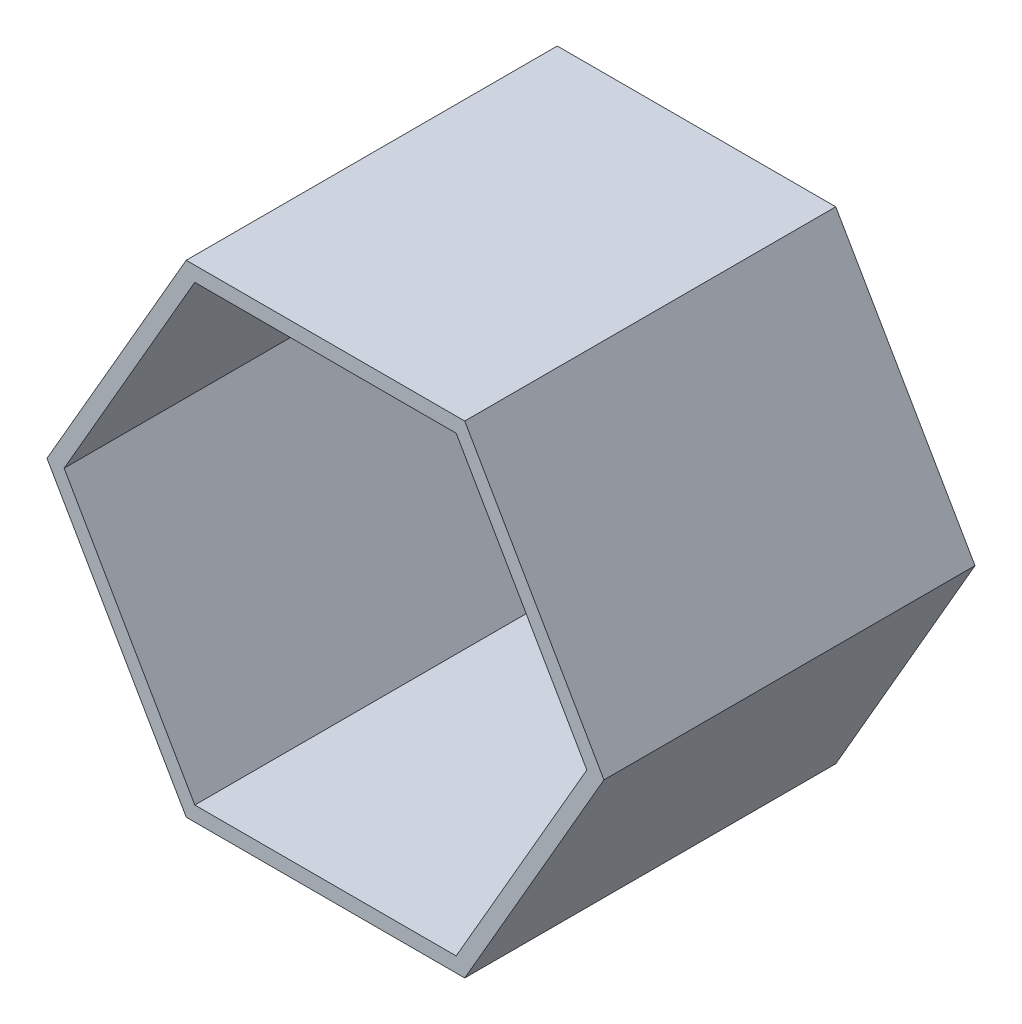
ISO-10303-21;
HEADER;
FILE_DESCRIPTION(('STEP AP214'),'2;1');
FILE_NAME('part.step','',(''),(''),'','','');
FILE_SCHEMA(('AUTOMOTIVE_DESIGN { 1 0 10303 214 1 1 1 1 }'));
ENDSEC;
DATA;
#1=APPLICATION_CONTEXT('core data for automotive mechanical design processes');
#2=APPLICATION_PROTOCOL_DEFINITION('international standard','automotive_design',2000,#1);
#3=PRODUCT_CONTEXT('',#1,'mechanical');
#4=PRODUCT('Part','Part','',(#3));
#5=PRODUCT_RELATED_PRODUCT_CATEGORY('part','',(#4));
#6=PRODUCT_DEFINITION_FORMATION('','',#4);
#7=PRODUCT_DEFINITION_CONTEXT('part definition',#1,'design');
#8=PRODUCT_DEFINITION('design','',#6,#7);
#9=PRODUCT_DEFINITION_SHAPE('','',#8);
#10=(LENGTH_UNIT() NAMED_UNIT(*) SI_UNIT(.MILLI.,.METRE.));
#11=(NAMED_UNIT(*) PLANE_ANGLE_UNIT() SI_UNIT($,.RADIAN.));
#12=(NAMED_UNIT(*) SI_UNIT($,.STERADIAN.) SOLID_ANGLE_UNIT());
#13=UNCERTAINTY_MEASURE_WITH_UNIT(LENGTH_MEASURE(1.E-05),#10,'distance_accuracy_value','');
#14=(GEOMETRIC_REPRESENTATION_CONTEXT(3) GLOBAL_UNCERTAINTY_ASSIGNED_CONTEXT((#13)) GLOBAL_UNIT_ASSIGNED_CONTEXT((#10,
#11,#12)) REPRESENTATION_CONTEXT('',''));
#15=CARTESIAN_POINT('',(0.,0.,0.));
#16=DIRECTION('',(0.,0.,1.));
#17=DIRECTION('',(1.,0.,0.));
#18=AXIS2_PLACEMENT_3D('',#15,#16,#17);
#19=CARTESIAN_POINT('',(0.,0.,15.));
#20=DIRECTION('',(0.,0.,1.));
#21=DIRECTION('',(1.,0.,0.));
#22=AXIS2_PLACEMENT_3D('',#19,#20,#21);
#23=PLANE('',#22);
#24=DIRECTION('',(0.5,0.866025403784438,0.));
#25=VECTOR('',#24,1.);
#26=CARTESIAN_POINT('',(-25.424550088957,1.9501465190243,15.));
#27=LINE('',#26,#25);
#28=CARTESIAN_POINT('',(-25.424550088957,1.9501465190243,15.));
#29=VERTEX_POINT('',#28);
#30=CARTESIAN_POINT('',(-19.7953849643581,11.7001465190243,15.));
#31=VERTEX_POINT('',#30);
#32=EDGE_CURVE('E173',#29,#31,#27,.T.);
#33=ORIENTED_EDGE('',*,*,#32,.T.);
#34=DIRECTION('',(-0.5,0.866025403784439,0.));
#35=VECTOR('',#34,1.);
#36=CARTESIAN_POINT('',(-19.7953849643581,11.7001465190243,15.));
#37=LINE('',#36,#35);
#38=CARTESIAN_POINT('',(-25.424550088957,21.4501465190243,15.));
#39=VERTEX_POINT('',#38);
#40=EDGE_CURVE('E176',#31,#39,#37,.T.);
#41=ORIENTED_EDGE('',*,*,#40,.T.);
#42=DIRECTION('',(-1.,0.,0.));
#43=VECTOR('',#42,1.);
#44=CARTESIAN_POINT('',(-25.424550088957,21.4501465190243,15.));
#45=LINE('',#44,#43);
#46=CARTESIAN_POINT('',(-36.6828803381547,21.4501465190243,15.));
#47=VERTEX_POINT('',#46);
#48=EDGE_CURVE('E179',#39,#47,#45,.T.);
#49=ORIENTED_EDGE('',*,*,#48,.T.);
#50=DIRECTION('',(-0.5,-0.866025403784439,0.));
#51=VECTOR('',#50,1.);
#52=CARTESIAN_POINT('',(-36.6828803381547,21.4501465190243,15.));
#53=LINE('',#52,#51);
#54=CARTESIAN_POINT('',(-42.3120454627535,11.7001465190243,15.));
#55=VERTEX_POINT('',#54);
#56=EDGE_CURVE('E181',#47,#55,#53,.T.);
#57=ORIENTED_EDGE('',*,*,#56,.T.);
#58=DIRECTION('',(0.5,-0.866025403784439,0.));
#59=VECTOR('',#58,1.);
#60=CARTESIAN_POINT('',(-42.3120454627535,11.7001465190243,15.));
#61=LINE('',#60,#59);
#62=CARTESIAN_POINT('',(-36.6828803381547,1.9501465190243,15.));
#63=VERTEX_POINT('',#62);
#64=EDGE_CURVE('E183',#55,#63,#61,.T.);
#65=ORIENTED_EDGE('',*,*,#64,.T.);
#66=DIRECTION('',(1.,0.,0.));
#67=VECTOR('',#66,1.);
#68=CARTESIAN_POINT('',(-36.6828803381547,1.9501465190243,15.));
#69=LINE('',#68,#67);
#70=EDGE_CURVE('E185',#63,#29,#69,.T.);
#71=ORIENTED_EDGE('',*,*,#70,.T.);
#72=EDGE_LOOP('',(#33,#41,#49,#57,#65,#71));
#73=FACE_BOUND('',#72,.T.);
#74=DIRECTION('',(-0.5,0.866025403784439,0.));
#75=VECTOR('',#74,1.);
#76=CARTESIAN_POINT('',(-20.4882052873857,11.7001465190243,15.));
#77=LINE('',#76,#75);
#78=CARTESIAN_POINT('',(-20.4882052873857,11.7001465190243,15.));
#79=VERTEX_POINT('',#78);
#80=CARTESIAN_POINT('',(-25.7709602504708,20.8501465190243,15.));
#81=VERTEX_POINT('',#80);
#82=EDGE_CURVE('E130',#79,#81,#77,.T.);
#83=ORIENTED_EDGE('',*,*,#82,.F.);
#84=DIRECTION('',(0.5,0.866025403784438,0.));
#85=VECTOR('',#84,1.);
#86=CARTESIAN_POINT('',(-25.7709602504708,2.5501465190243,15.));
#87=LINE('',#86,#85);
#88=CARTESIAN_POINT('',(-25.7709602504708,2.5501465190243,15.));
#89=VERTEX_POINT('',#88);
#90=EDGE_CURVE('E122',#89,#79,#87,.T.);
#91=ORIENTED_EDGE('',*,*,#90,.F.);
#92=DIRECTION('',(1.,0.,0.));
#93=VECTOR('',#92,1.);
#94=CARTESIAN_POINT('',(-36.3364701766409,2.5501465190243,15.));
#95=LINE('',#94,#93);
#96=CARTESIAN_POINT('',(-36.3364701766409,2.5501465190243,15.));
#97=VERTEX_POINT('',#96);
#98=EDGE_CURVE('E151',#97,#89,#95,.T.);
#99=ORIENTED_EDGE('',*,*,#98,.F.);
#100=DIRECTION('',(0.499999999999999,-0.866025403784439,0.));
#101=VECTOR('',#100,1.);
#102=CARTESIAN_POINT('',(-41.619225139726,11.7001465190243,15.));
#103=LINE('',#102,#101);
#104=CARTESIAN_POINT('',(-41.619225139726,11.7001465190243,15.));
#105=VERTEX_POINT('',#104);
#106=EDGE_CURVE('E149',#105,#97,#103,.T.);
#107=ORIENTED_EDGE('',*,*,#106,.F.);
#108=DIRECTION('',(-0.5,-0.866025403784439,0.));
#109=VECTOR('',#108,1.);
#110=CARTESIAN_POINT('',(-36.3364701766409,20.8501465190243,15.));
#111=LINE('',#110,#109);
#112=CARTESIAN_POINT('',(-36.3364701766409,20.8501465190243,15.));
#113=VERTEX_POINT('',#112);
#114=EDGE_CURVE('E145',#113,#105,#111,.T.);
#115=ORIENTED_EDGE('',*,*,#114,.F.);
#116=DIRECTION('',(-1.,0.,0.));
#117=VECTOR('',#116,1.);
#118=CARTESIAN_POINT('',(-25.7709602504708,20.8501465190243,15.));
#119=LINE('',#118,#117);
#120=EDGE_CURVE('E143',#81,#113,#119,.T.);
#121=ORIENTED_EDGE('',*,*,#120,.F.);
#122=EDGE_LOOP('',(#83,#91,#99,#107,#115,#121));
#123=FACE_BOUND('',#122,.T.);
#124=ADVANCED_FACE('F33',(#73,#123),#23,.T.);
#125=CARTESIAN_POINT('',(0.,0.,0.));
#126=DIRECTION('',(0.,0.,1.));
#127=DIRECTION('',(1.,0.,0.));
#128=AXIS2_PLACEMENT_3D('',#125,#126,#127);
#129=PLANE('',#128);
#130=DIRECTION('',(0.5,0.866025403784438,0.));
#131=VECTOR('',#130,1.);
#132=CARTESIAN_POINT('',(-25.424550088957,1.9501465190243,0.));
#133=LINE('',#132,#131);
#134=CARTESIAN_POINT('',(-25.424550088957,1.9501465190243,0.));
#135=VERTEX_POINT('',#134);
#136=CARTESIAN_POINT('',(-19.7953849643581,11.7001465190243,0.));
#137=VERTEX_POINT('',#136);
#138=EDGE_CURVE('E138',#135,#137,#133,.T.);
#139=ORIENTED_EDGE('',*,*,#138,.F.);
#140=DIRECTION('',(1.,0.,0.));
#141=VECTOR('',#140,1.);
#142=CARTESIAN_POINT('',(-36.6828803381547,1.9501465190243,0.));
#143=LINE('',#142,#141);
#144=CARTESIAN_POINT('',(-36.6828803381547,1.9501465190243,0.));
#145=VERTEX_POINT('',#144);
#146=EDGE_CURVE('E177',#145,#135,#143,.T.);
#147=ORIENTED_EDGE('',*,*,#146,.F.);
#148=DIRECTION('',(0.5,-0.866025403784439,0.));
#149=VECTOR('',#148,1.);
#150=CARTESIAN_POINT('',(-42.3120454627535,11.7001465190243,0.));
#151=LINE('',#150,#149);
#152=CARTESIAN_POINT('',(-42.3120454627535,11.7001465190243,0.));
#153=VERTEX_POINT('',#152);
#154=EDGE_CURVE('E196',#153,#145,#151,.T.);
#155=ORIENTED_EDGE('',*,*,#154,.F.);
#156=DIRECTION('',(-0.5,-0.866025403784439,0.));
#157=VECTOR('',#156,1.);
#158=CARTESIAN_POINT('',(-36.6828803381547,21.4501465190243,0.));
#159=LINE('',#158,#157);
#160=CARTESIAN_POINT('',(-36.6828803381547,21.4501465190243,0.));
#161=VERTEX_POINT('',#160);
#162=EDGE_CURVE('E194',#161,#153,#159,.T.);
#163=ORIENTED_EDGE('',*,*,#162,.F.);
#164=DIRECTION('',(-1.,0.,0.));
#165=VECTOR('',#164,1.);
#166=CARTESIAN_POINT('',(-25.424550088957,21.4501465190243,0.));
#167=LINE('',#166,#165);
#168=CARTESIAN_POINT('',(-25.424550088957,21.4501465190243,0.));
#169=VERTEX_POINT('',#168);
#170=EDGE_CURVE('E192',#169,#161,#167,.T.);
#171=ORIENTED_EDGE('',*,*,#170,.F.);
#172=DIRECTION('',(-0.5,0.866025403784439,0.));
#173=VECTOR('',#172,1.);
#174=CARTESIAN_POINT('',(-19.7953849643581,11.7001465190243,0.));
#175=LINE('',#174,#173);
#176=EDGE_CURVE('E190',#137,#169,#175,.T.);
#177=ORIENTED_EDGE('',*,*,#176,.F.);
#178=EDGE_LOOP('',(#139,#147,#155,#163,#171,#177));
#179=FACE_BOUND('',#178,.T.);
#180=DIRECTION('',(0.5,0.866025403784438,0.));
#181=VECTOR('',#180,1.);
#182=CARTESIAN_POINT('',(-25.7709602504708,2.5501465190243,0.));
#183=LINE('',#182,#181);
#184=CARTESIAN_POINT('',(-25.7709602504708,2.5501465190243,0.));
#185=VERTEX_POINT('',#184);
#186=CARTESIAN_POINT('',(-20.4882052873857,11.7001465190243,0.));
#187=VERTEX_POINT('',#186);
#188=EDGE_CURVE('E56',#185,#187,#183,.T.);
#189=ORIENTED_EDGE('',*,*,#188,.T.);
#190=DIRECTION('',(-0.5,0.866025403784439,0.));
#191=VECTOR('',#190,1.);
#192=CARTESIAN_POINT('',(-20.4882052873857,11.7001465190243,0.));
#193=LINE('',#192,#191);
#194=CARTESIAN_POINT('',(-25.7709602504708,20.8501465190243,0.));
#195=VERTEX_POINT('',#194);
#196=EDGE_CURVE('E137',#187,#195,#193,.T.);
#197=ORIENTED_EDGE('',*,*,#196,.T.);
#198=DIRECTION('',(-1.,0.,0.));
#199=VECTOR('',#198,1.);
#200=CARTESIAN_POINT('',(-25.7709602504708,20.8501465190243,0.));
#201=LINE('',#200,#199);
#202=CARTESIAN_POINT('',(-36.3364701766409,20.8501465190243,0.));
#203=VERTEX_POINT('',#202);
#204=EDGE_CURVE('E155',#195,#203,#201,.T.);
#205=ORIENTED_EDGE('',*,*,#204,.T.);
#206=DIRECTION('',(-0.5,-0.866025403784439,0.));
#207=VECTOR('',#206,1.);
#208=CARTESIAN_POINT('',(-36.3364701766409,20.8501465190243,0.));
#209=LINE('',#208,#207);
#210=CARTESIAN_POINT('',(-41.619225139726,11.7001465190243,0.));
#211=VERTEX_POINT('',#210);
#212=EDGE_CURVE('E158',#203,#211,#209,.T.);
#213=ORIENTED_EDGE('',*,*,#212,.T.);
#214=DIRECTION('',(0.499999999999999,-0.866025403784439,0.));
#215=VECTOR('',#214,1.);
#216=CARTESIAN_POINT('',(-41.619225139726,11.7001465190243,0.));
#217=LINE('',#216,#215);
#218=CARTESIAN_POINT('',(-36.3364701766409,2.5501465190243,0.));
#219=VERTEX_POINT('',#218);
#220=EDGE_CURVE('E161',#211,#219,#217,.T.);
#221=ORIENTED_EDGE('',*,*,#220,.T.);
#222=DIRECTION('',(1.,0.,0.));
#223=VECTOR('',#222,1.);
#224=CARTESIAN_POINT('',(-36.3364701766409,2.5501465190243,0.));
#225=LINE('',#224,#223);
#226=EDGE_CURVE('E131',#219,#185,#225,.T.);
#227=ORIENTED_EDGE('',*,*,#226,.T.);
#228=EDGE_LOOP('',(#189,#197,#205,#213,#221,#227));
#229=FACE_BOUND('',#228,.T.);
#230=ADVANCED_FACE('F220',(#179,#229),#129,.F.);
#231=CARTESIAN_POINT('',(-25.424550088957,1.9501465190243,15.));
#232=DIRECTION('',(-0.866025403784438,0.5,0.));
#233=DIRECTION('',(-0.5,-0.866025403784439,0.));
#234=AXIS2_PLACEMENT_3D('',#231,#232,#233);
#235=PLANE('',#234);
#236=ORIENTED_EDGE('',*,*,#138,.T.);
#237=DIRECTION('',(0.,0.,-1.));
#238=VECTOR('',#237,1.);
#239=CARTESIAN_POINT('',(-19.7953849643581,11.7001465190243,15.));
#240=LINE('',#239,#238);
#241=EDGE_CURVE('E11',#31,#137,#240,.T.);
#242=ORIENTED_EDGE('',*,*,#241,.F.);
#243=ORIENTED_EDGE('',*,*,#32,.F.);
#244=DIRECTION('',(0.,0.,-1.));
#245=VECTOR('',#244,1.);
#246=CARTESIAN_POINT('',(-25.424550088957,1.9501465190243,15.));
#247=LINE('',#246,#245);
#248=EDGE_CURVE('E187',#29,#135,#247,.T.);
#249=ORIENTED_EDGE('',*,*,#248,.T.);
#250=EDGE_LOOP('',(#236,#242,#243,#249));
#251=FACE_BOUND('',#250,.T.);
#252=ADVANCED_FACE('F35',(#251),#235,.F.);
#253=CARTESIAN_POINT('',(-19.7953849643581,11.7001465190243,15.));
#254=DIRECTION('',(-0.866025403784439,-0.5,0.));
#255=DIRECTION('',(0.5,-0.866025403784439,0.));
#256=AXIS2_PLACEMENT_3D('',#253,#254,#255);
#257=PLANE('',#256);
#258=ORIENTED_EDGE('',*,*,#176,.T.);
#259=DIRECTION('',(0.,0.,-1.));
#260=VECTOR('',#259,1.);
#261=CARTESIAN_POINT('',(-25.424550088957,21.4501465190243,15.));
#262=LINE('',#261,#260);
#263=EDGE_CURVE('E41',#39,#169,#262,.T.);
#264=ORIENTED_EDGE('',*,*,#263,.F.);
#265=ORIENTED_EDGE('',*,*,#40,.F.);
#266=ORIENTED_EDGE('',*,*,#241,.T.);
#267=EDGE_LOOP('',(#258,#264,#265,#266));
#268=FACE_BOUND('',#267,.T.);
#269=ADVANCED_FACE('F237',(#268),#257,.F.);
#270=CARTESIAN_POINT('',(-25.424550088957,21.4501465190243,15.));
#271=DIRECTION('',(0.,-1.,0.));
#272=DIRECTION('',(0.,0.,-1.));
#273=AXIS2_PLACEMENT_3D('',#270,#271,#272);
#274=PLANE('',#273);
#275=ORIENTED_EDGE('',*,*,#170,.T.);
#276=DIRECTION('',(0.,0.,-1.));
#277=VECTOR('',#276,1.);
#278=CARTESIAN_POINT('',(-36.6828803381547,21.4501465190243,15.));
#279=LINE('',#278,#277);
#280=EDGE_CURVE('E207',#47,#161,#279,.T.);
#281=ORIENTED_EDGE('',*,*,#280,.F.);
#282=ORIENTED_EDGE('',*,*,#48,.F.);
#283=ORIENTED_EDGE('',*,*,#263,.T.);
#284=EDGE_LOOP('',(#275,#281,#282,#283));
#285=FACE_BOUND('',#284,.T.);
#286=ADVANCED_FACE('F214',(#285),#274,.F.);
#287=CARTESIAN_POINT('',(-36.6828803381547,21.4501465190243,15.));
#288=DIRECTION('',(0.866025403784439,-0.5,0.));
#289=DIRECTION('',(0.5,0.866025403784439,0.));
#290=AXIS2_PLACEMENT_3D('',#287,#288,#289);
#291=PLANE('',#290);
#292=ORIENTED_EDGE('',*,*,#162,.T.);
#293=DIRECTION('',(0.,0.,-1.));
#294=VECTOR('',#293,1.);
#295=CARTESIAN_POINT('',(-42.3120454627535,11.7001465190243,15.));
#296=LINE('',#295,#294);
#297=EDGE_CURVE('E204',#55,#153,#296,.T.);
#298=ORIENTED_EDGE('',*,*,#297,.F.);
#299=ORIENTED_EDGE('',*,*,#56,.F.);
#300=ORIENTED_EDGE('',*,*,#280,.T.);
#301=EDGE_LOOP('',(#292,#298,#299,#300));
#302=FACE_BOUND('',#301,.T.);
#303=ADVANCED_FACE('F226',(#302),#291,.F.);
#304=CARTESIAN_POINT('',(-42.3120454627535,11.7001465190243,15.));
#305=DIRECTION('',(0.866025403784439,0.5,0.));
#306=DIRECTION('',(-0.5,0.866025403784439,0.));
#307=AXIS2_PLACEMENT_3D('',#304,#305,#306);
#308=PLANE('',#307);
#309=ORIENTED_EDGE('',*,*,#154,.T.);
#310=DIRECTION('',(0.,0.,-1.));
#311=VECTOR('',#310,1.);
#312=CARTESIAN_POINT('',(-36.6828803381547,1.9501465190243,15.));
#313=LINE('',#312,#311);
#314=EDGE_CURVE('E201',#63,#145,#313,.T.);
#315=ORIENTED_EDGE('',*,*,#314,.F.);
#316=ORIENTED_EDGE('',*,*,#64,.F.);
#317=ORIENTED_EDGE('',*,*,#297,.T.);
#318=EDGE_LOOP('',(#309,#315,#316,#317));
#319=FACE_BOUND('',#318,.T.);
#320=ADVANCED_FACE('F230',(#319),#308,.F.);
#321=CARTESIAN_POINT('',(-36.6828803381547,1.9501465190243,15.));
#322=DIRECTION('',(0.,1.,0.));
#323=DIRECTION('',(-1.,0.,0.));
#324=AXIS2_PLACEMENT_3D('',#321,#322,#323);
#325=PLANE('',#324);
#326=ORIENTED_EDGE('',*,*,#146,.T.);
#327=ORIENTED_EDGE('',*,*,#248,.F.);
#328=ORIENTED_EDGE('',*,*,#70,.F.);
#329=ORIENTED_EDGE('',*,*,#314,.T.);
#330=EDGE_LOOP('',(#326,#327,#328,#329));
#331=FACE_BOUND('',#330,.T.);
#332=ADVANCED_FACE('F240',(#331),#325,.F.);
#333=CARTESIAN_POINT('',(-25.7709602504708,2.5501465190243,15.));
#334=DIRECTION('',(-0.866025403784439,0.5,0.));
#335=DIRECTION('',(-0.5,-0.866025403784439,0.));
#336=AXIS2_PLACEMENT_3D('',#333,#334,#335);
#337=PLANE('',#336);
#338=ORIENTED_EDGE('',*,*,#188,.F.);
#339=DIRECTION('',(0.,0.,-1.));
#340=VECTOR('',#339,1.);
#341=CARTESIAN_POINT('',(-25.7709602504708,2.5501465190243,15.));
#342=LINE('',#341,#340);
#343=EDGE_CURVE('E126',#89,#185,#342,.T.);
#344=ORIENTED_EDGE('',*,*,#343,.F.);
#345=ORIENTED_EDGE('',*,*,#90,.T.);
#346=DIRECTION('',(0.,0.,-1.));
#347=VECTOR('',#346,1.);
#348=CARTESIAN_POINT('',(-20.4882052873857,11.7001465190243,15.));
#349=LINE('',#348,#347);
#350=EDGE_CURVE('E125',#79,#187,#349,.T.);
#351=ORIENTED_EDGE('',*,*,#350,.T.);
#352=EDGE_LOOP('',(#338,#344,#345,#351));
#353=FACE_BOUND('',#352,.T.);
#354=ADVANCED_FACE('F124',(#353),#337,.T.);
#355=CARTESIAN_POINT('',(-20.4882052873857,11.7001465190243,15.));
#356=DIRECTION('',(-0.866025403784439,-0.5,0.));
#357=DIRECTION('',(0.5,-0.866025403784439,0.));
#358=AXIS2_PLACEMENT_3D('',#355,#356,#357);
#359=PLANE('',#358);
#360=ORIENTED_EDGE('',*,*,#196,.F.);
#361=ORIENTED_EDGE('',*,*,#350,.F.);
#362=ORIENTED_EDGE('',*,*,#82,.T.);
#363=DIRECTION('',(0.,0.,-1.));
#364=VECTOR('',#363,1.);
#365=CARTESIAN_POINT('',(-25.7709602504708,20.8501465190243,15.));
#366=LINE('',#365,#364);
#367=EDGE_CURVE('E139',#81,#195,#366,.T.);
#368=ORIENTED_EDGE('',*,*,#367,.T.);
#369=EDGE_LOOP('',(#360,#361,#362,#368));
#370=FACE_BOUND('',#369,.T.);
#371=ADVANCED_FACE('F134',(#370),#359,.T.);
#372=CARTESIAN_POINT('',(-25.7709602504708,20.8501465190243,15.));
#373=DIRECTION('',(0.,-1.,0.));
#374=DIRECTION('',(0.,0.,-1.));
#375=AXIS2_PLACEMENT_3D('',#372,#373,#374);
#376=PLANE('',#375);
#377=ORIENTED_EDGE('',*,*,#204,.F.);
#378=ORIENTED_EDGE('',*,*,#367,.F.);
#379=ORIENTED_EDGE('',*,*,#120,.T.);
#380=DIRECTION('',(0.,0.,-1.));
#381=VECTOR('',#380,1.);
#382=CARTESIAN_POINT('',(-36.3364701766409,20.8501465190243,15.));
#383=LINE('',#382,#381);
#384=EDGE_CURVE('E170',#113,#203,#383,.T.);
#385=ORIENTED_EDGE('',*,*,#384,.T.);
#386=EDGE_LOOP('',(#377,#378,#379,#385));
#387=FACE_BOUND('',#386,.T.);
#388=ADVANCED_FACE('F258',(#387),#376,.T.);
#389=CARTESIAN_POINT('',(-36.3364701766409,20.8501465190243,15.));
#390=DIRECTION('',(0.866025403784439,-0.5,0.));
#391=DIRECTION('',(0.5,0.866025403784439,0.));
#392=AXIS2_PLACEMENT_3D('',#389,#390,#391);
#393=PLANE('',#392);
#394=ORIENTED_EDGE('',*,*,#212,.F.);
#395=ORIENTED_EDGE('',*,*,#384,.F.);
#396=ORIENTED_EDGE('',*,*,#114,.T.);
#397=DIRECTION('',(0.,0.,-1.));
#398=VECTOR('',#397,1.);
#399=CARTESIAN_POINT('',(-41.619225139726,11.7001465190243,15.));
#400=LINE('',#399,#398);
#401=EDGE_CURVE('E168',#105,#211,#400,.T.);
#402=ORIENTED_EDGE('',*,*,#401,.T.);
#403=EDGE_LOOP('',(#394,#395,#396,#402));
#404=FACE_BOUND('',#403,.T.);
#405=ADVANCED_FACE('F261',(#404),#393,.T.);
#406=CARTESIAN_POINT('',(-41.619225139726,11.7001465190243,15.));
#407=DIRECTION('',(0.866025403784439,0.499999999999999,0.));
#408=DIRECTION('',(-0.5,0.866025403784439,0.));
#409=AXIS2_PLACEMENT_3D('',#406,#407,#408);
#410=PLANE('',#409);
#411=ORIENTED_EDGE('',*,*,#220,.F.);
#412=ORIENTED_EDGE('',*,*,#401,.F.);
#413=ORIENTED_EDGE('',*,*,#106,.T.);
#414=DIRECTION('',(0.,0.,-1.));
#415=VECTOR('',#414,1.);
#416=CARTESIAN_POINT('',(-36.3364701766409,2.5501465190243,15.));
#417=LINE('',#416,#415);
#418=EDGE_CURVE('E48',#97,#219,#417,.T.);
#419=ORIENTED_EDGE('',*,*,#418,.T.);
#420=EDGE_LOOP('',(#411,#412,#413,#419));
#421=FACE_BOUND('',#420,.T.);
#422=ADVANCED_FACE('F265',(#421),#410,.T.);
#423=CARTESIAN_POINT('',(-36.3364701766409,2.5501465190243,15.));
#424=DIRECTION('',(0.,1.,0.));
#425=DIRECTION('',(-1.,0.,0.));
#426=AXIS2_PLACEMENT_3D('',#423,#424,#425);
#427=PLANE('',#426);
#428=ORIENTED_EDGE('',*,*,#226,.F.);
#429=ORIENTED_EDGE('',*,*,#418,.F.);
#430=ORIENTED_EDGE('',*,*,#98,.T.);
#431=ORIENTED_EDGE('',*,*,#343,.T.);
#432=EDGE_LOOP('',(#428,#429,#430,#431));
#433=FACE_BOUND('',#432,.T.);
#434=ADVANCED_FACE('F269',(#433),#427,.T.);
#435=CLOSED_SHELL('',(#124,#230,#252,#269,#286,#303,#320,#332,#354,#371,#388,#405,#422,#434));
#436=MANIFOLD_SOLID_BREP('B2',#435);
#437=ADVANCED_BREP_SHAPE_REPRESENTATION('',(#18,#436),#14);
#438=SHAPE_DEFINITION_REPRESENTATION(#9,#437);
ENDSEC;
END-ISO-10303-21;
